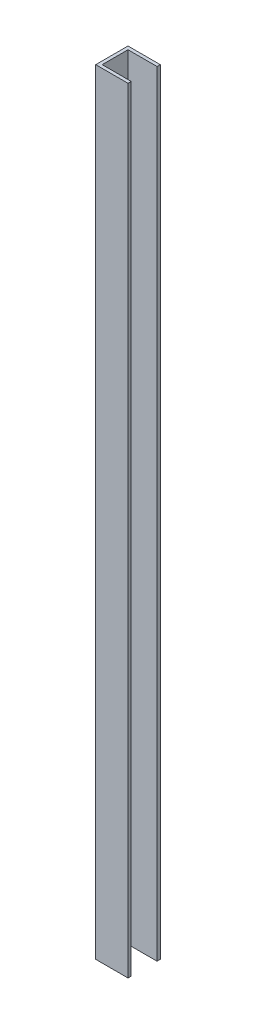
ISO-10303-21;
HEADER;
FILE_DESCRIPTION(('STEP AP214'),'2;1');
FILE_NAME('part.step','',(''),(''),'','','');
FILE_SCHEMA(('AUTOMOTIVE_DESIGN { 1 0 10303 214 1 1 1 1 }'));
ENDSEC;
DATA;
#1=APPLICATION_CONTEXT('core data for automotive mechanical design processes');
#2=APPLICATION_PROTOCOL_DEFINITION('international standard','automotive_design',2000,#1);
#3=PRODUCT_CONTEXT('',#1,'mechanical');
#4=PRODUCT('Part','Part','',(#3));
#5=PRODUCT_RELATED_PRODUCT_CATEGORY('part','',(#4));
#6=PRODUCT_DEFINITION_FORMATION('','',#4);
#7=PRODUCT_DEFINITION_CONTEXT('part definition',#1,'design');
#8=PRODUCT_DEFINITION('design','',#6,#7);
#9=PRODUCT_DEFINITION_SHAPE('','',#8);
#10=(LENGTH_UNIT() NAMED_UNIT(*) SI_UNIT(.MILLI.,.METRE.));
#11=(NAMED_UNIT(*) PLANE_ANGLE_UNIT() SI_UNIT($,.RADIAN.));
#12=(NAMED_UNIT(*) SI_UNIT($,.STERADIAN.) SOLID_ANGLE_UNIT());
#13=UNCERTAINTY_MEASURE_WITH_UNIT(LENGTH_MEASURE(1.E-05),#10,'distance_accuracy_value','');
#14=(GEOMETRIC_REPRESENTATION_CONTEXT(3) GLOBAL_UNCERTAINTY_ASSIGNED_CONTEXT((#13)) GLOBAL_UNIT_ASSIGNED_CONTEXT((#10,
#11,#12)) REPRESENTATION_CONTEXT('',''));
#15=CARTESIAN_POINT('',(0.,0.,0.));
#16=DIRECTION('',(0.,0.,1.));
#17=DIRECTION('',(1.,0.,0.));
#18=AXIS2_PLACEMENT_3D('',#15,#16,#17);
#19=CARTESIAN_POINT('',(-4.,240.,4.));
#20=DIRECTION('',(0.,0.,1.));
#21=DIRECTION('',(1.,0.,0.));
#22=AXIS2_PLACEMENT_3D('',#19,#20,#21);
#23=PLANE('',#22);
#24=DIRECTION('',(-1.,0.,0.));
#25=VECTOR('',#24,1.);
#26=CARTESIAN_POINT('',(-4.,0.,4.));
#27=LINE('',#26,#25);
#28=CARTESIAN_POINT('',(5.,0.,4.));
#29=VERTEX_POINT('',#28);
#30=CARTESIAN_POINT('',(-4.,0.,4.));
#31=VERTEX_POINT('',#30);
#32=EDGE_CURVE('E87',#29,#31,#27,.T.);
#33=ORIENTED_EDGE('',*,*,#32,.T.);
#34=DIRECTION('',(0.,-1.,0.));
#35=VECTOR('',#34,1.);
#36=CARTESIAN_POINT('',(-4.,240.,4.));
#37=LINE('',#36,#35);
#38=CARTESIAN_POINT('',(-4.,240.,4.));
#39=VERTEX_POINT('',#38);
#40=EDGE_CURVE('E11',#39,#31,#37,.T.);
#41=ORIENTED_EDGE('',*,*,#40,.F.);
#42=DIRECTION('',(-1.,0.,0.));
#43=VECTOR('',#42,1.);
#44=CARTESIAN_POINT('',(4.,240.,4.));
#45=LINE('',#44,#43);
#46=CARTESIAN_POINT('',(5.,240.,4.));
#47=VERTEX_POINT('',#46);
#48=EDGE_CURVE('E93',#47,#39,#45,.T.);
#49=ORIENTED_EDGE('',*,*,#48,.F.);
#50=DIRECTION('',(0.,-1.,0.));
#51=VECTOR('',#50,1.);
#52=CARTESIAN_POINT('',(5.,240.,4.));
#53=LINE('',#52,#51);
#54=EDGE_CURVE('E127',#47,#29,#53,.T.);
#55=ORIENTED_EDGE('',*,*,#54,.T.);
#56=EDGE_LOOP('',(#33,#41,#49,#55));
#57=FACE_BOUND('',#56,.T.);
#58=ADVANCED_FACE('F35',(#57),#23,.F.);
#59=CARTESIAN_POINT('',(-4.,240.,-4.));
#60=DIRECTION('',(-1.,0.,0.));
#61=DIRECTION('',(0.,0.,1.));
#62=AXIS2_PLACEMENT_3D('',#59,#60,#61);
#63=PLANE('',#62);
#64=DIRECTION('',(0.,0.,-1.));
#65=VECTOR('',#64,1.);
#66=CARTESIAN_POINT('',(-4.,0.,-4.));
#67=LINE('',#66,#65);
#68=CARTESIAN_POINT('',(-4.,0.,-4.));
#69=VERTEX_POINT('',#68);
#70=EDGE_CURVE('E132',#31,#69,#67,.T.);
#71=ORIENTED_EDGE('',*,*,#70,.T.);
#72=DIRECTION('',(0.,-1.,0.));
#73=VECTOR('',#72,1.);
#74=CARTESIAN_POINT('',(-4.,240.,-4.));
#75=LINE('',#74,#73);
#76=CARTESIAN_POINT('',(-4.,240.,-4.));
#77=VERTEX_POINT('',#76);
#78=EDGE_CURVE('E43',#77,#69,#75,.T.);
#79=ORIENTED_EDGE('',*,*,#78,.F.);
#80=DIRECTION('',(0.,0.,-1.));
#81=VECTOR('',#80,1.);
#82=CARTESIAN_POINT('',(-4.,240.,-4.));
#83=LINE('',#82,#81);
#84=EDGE_CURVE('E164',#39,#77,#83,.T.);
#85=ORIENTED_EDGE('',*,*,#84,.F.);
#86=ORIENTED_EDGE('',*,*,#40,.T.);
#87=EDGE_LOOP('',(#71,#79,#85,#86));
#88=FACE_BOUND('',#87,.T.);
#89=ADVANCED_FACE('F163',(#88),#63,.F.);
#90=CARTESIAN_POINT('',(4.,240.,-4.));
#91=DIRECTION('',(0.,0.,-1.));
#92=DIRECTION('',(-1.,0.,0.));
#93=AXIS2_PLACEMENT_3D('',#90,#91,#92);
#94=PLANE('',#93);
#95=DIRECTION('',(1.,0.,0.));
#96=VECTOR('',#95,1.);
#97=CARTESIAN_POINT('',(4.,0.,-4.));
#98=LINE('',#97,#96);
#99=CARTESIAN_POINT('',(5.,0.,-4.));
#100=VERTEX_POINT('',#99);
#101=EDGE_CURVE('E135',#69,#100,#98,.T.);
#102=ORIENTED_EDGE('',*,*,#101,.T.);
#103=DIRECTION('',(0.,-1.,0.));
#104=VECTOR('',#103,1.);
#105=CARTESIAN_POINT('',(5.,240.,-4.));
#106=LINE('',#105,#104);
#107=CARTESIAN_POINT('',(5.,240.,-4.));
#108=VERTEX_POINT('',#107);
#109=EDGE_CURVE('E152',#108,#100,#106,.T.);
#110=ORIENTED_EDGE('',*,*,#109,.F.);
#111=DIRECTION('',(1.,0.,0.));
#112=VECTOR('',#111,1.);
#113=CARTESIAN_POINT('',(-4.,240.,-4.));
#114=LINE('',#113,#112);
#115=EDGE_CURVE('E160',#77,#108,#114,.T.);
#116=ORIENTED_EDGE('',*,*,#115,.F.);
#117=ORIENTED_EDGE('',*,*,#78,.T.);
#118=EDGE_LOOP('',(#102,#110,#116,#117));
#119=FACE_BOUND('',#118,.T.);
#120=ADVANCED_FACE('F158',(#119),#94,.F.);
#121=CARTESIAN_POINT('',(5.,240.,-5.));
#122=DIRECTION('',(-1.,0.,0.));
#123=DIRECTION('',(0.,0.,1.));
#124=AXIS2_PLACEMENT_3D('',#121,#122,#123);
#125=PLANE('',#124);
#126=DIRECTION('',(0.,0.,-1.));
#127=VECTOR('',#126,1.);
#128=CARTESIAN_POINT('',(5.,0.,-5.));
#129=LINE('',#128,#127);
#130=CARTESIAN_POINT('',(5.,0.,-5.));
#131=VERTEX_POINT('',#130);
#132=EDGE_CURVE('E137',#100,#131,#129,.T.);
#133=ORIENTED_EDGE('',*,*,#132,.T.);
#134=DIRECTION('',(0.,-1.,0.));
#135=VECTOR('',#134,1.);
#136=CARTESIAN_POINT('',(5.,240.,-5.));
#137=LINE('',#136,#135);
#138=CARTESIAN_POINT('',(5.,240.,-5.));
#139=VERTEX_POINT('',#138);
#140=EDGE_CURVE('E149',#139,#131,#137,.T.);
#141=ORIENTED_EDGE('',*,*,#140,.F.);
#142=DIRECTION('',(0.,0.,-1.));
#143=VECTOR('',#142,1.);
#144=CARTESIAN_POINT('',(5.,240.,-5.));
#145=LINE('',#144,#143);
#146=EDGE_CURVE('E174',#108,#139,#145,.T.);
#147=ORIENTED_EDGE('',*,*,#146,.F.);
#148=ORIENTED_EDGE('',*,*,#109,.T.);
#149=EDGE_LOOP('',(#133,#141,#147,#148));
#150=FACE_BOUND('',#149,.T.);
#151=ADVANCED_FACE('F170',(#150),#125,.F.);
#152=CARTESIAN_POINT('',(-5.,240.,-5.));
#153=DIRECTION('',(0.,0.,1.));
#154=DIRECTION('',(1.,0.,0.));
#155=AXIS2_PLACEMENT_3D('',#152,#153,#154);
#156=PLANE('',#155);
#157=DIRECTION('',(-1.,0.,0.));
#158=VECTOR('',#157,1.);
#159=CARTESIAN_POINT('',(-5.,0.,-5.));
#160=LINE('',#159,#158);
#161=CARTESIAN_POINT('',(-5.,0.,-5.));
#162=VERTEX_POINT('',#161);
#163=EDGE_CURVE('E139',#131,#162,#160,.T.);
#164=ORIENTED_EDGE('',*,*,#163,.T.);
#165=DIRECTION('',(0.,-1.,0.));
#166=VECTOR('',#165,1.);
#167=CARTESIAN_POINT('',(-5.,240.,-5.));
#168=LINE('',#167,#166);
#169=CARTESIAN_POINT('',(-5.,240.,-5.));
#170=VERTEX_POINT('',#169);
#171=EDGE_CURVE('E122',#170,#162,#168,.T.);
#172=ORIENTED_EDGE('',*,*,#171,.F.);
#173=DIRECTION('',(-1.,0.,0.));
#174=VECTOR('',#173,1.);
#175=CARTESIAN_POINT('',(-5.,240.,-5.));
#176=LINE('',#175,#174);
#177=EDGE_CURVE('E113',#139,#170,#176,.T.);
#178=ORIENTED_EDGE('',*,*,#177,.F.);
#179=ORIENTED_EDGE('',*,*,#140,.T.);
#180=EDGE_LOOP('',(#164,#172,#178,#179));
#181=FACE_BOUND('',#180,.T.);
#182=ADVANCED_FACE('F173',(#181),#156,.F.);
#183=CARTESIAN_POINT('',(-5.,240.,-5.));
#184=DIRECTION('',(1.,0.,0.));
#185=DIRECTION('',(0.,0.,-1.));
#186=AXIS2_PLACEMENT_3D('',#183,#184,#185);
#187=PLANE('',#186);
#188=DIRECTION('',(0.,0.,1.));
#189=VECTOR('',#188,1.);
#190=CARTESIAN_POINT('',(-5.,0.,-5.));
#191=LINE('',#190,#189);
#192=CARTESIAN_POINT('',(-5.,0.,5.));
#193=VERTEX_POINT('',#192);
#194=EDGE_CURVE('E121',#162,#193,#191,.T.);
#195=ORIENTED_EDGE('',*,*,#194,.T.);
#196=DIRECTION('',(0.,-1.,0.));
#197=VECTOR('',#196,1.);
#198=CARTESIAN_POINT('',(-5.,240.,5.));
#199=LINE('',#198,#197);
#200=CARTESIAN_POINT('',(-5.,240.,5.));
#201=VERTEX_POINT('',#200);
#202=EDGE_CURVE('E118',#201,#193,#199,.T.);
#203=ORIENTED_EDGE('',*,*,#202,.F.);
#204=DIRECTION('',(0.,0.,1.));
#205=VECTOR('',#204,1.);
#206=CARTESIAN_POINT('',(-5.,240.,-5.));
#207=LINE('',#206,#205);
#208=EDGE_CURVE('E107',#170,#201,#207,.T.);
#209=ORIENTED_EDGE('',*,*,#208,.F.);
#210=ORIENTED_EDGE('',*,*,#171,.T.);
#211=EDGE_LOOP('',(#195,#203,#209,#210));
#212=FACE_BOUND('',#211,.T.);
#213=ADVANCED_FACE('F119',(#212),#187,.F.);
#214=CARTESIAN_POINT('',(-5.,240.,5.));
#215=DIRECTION('',(0.,0.,-1.));
#216=DIRECTION('',(-1.,0.,0.));
#217=AXIS2_PLACEMENT_3D('',#214,#215,#216);
#218=PLANE('',#217);
#219=DIRECTION('',(1.,0.,0.));
#220=VECTOR('',#219,1.);
#221=CARTESIAN_POINT('',(-5.,0.,5.));
#222=LINE('',#221,#220);
#223=CARTESIAN_POINT('',(5.,0.,5.));
#224=VERTEX_POINT('',#223);
#225=EDGE_CURVE('E80',#193,#224,#222,.T.);
#226=ORIENTED_EDGE('',*,*,#225,.T.);
#227=DIRECTION('',(0.,-1.,0.));
#228=VECTOR('',#227,1.);
#229=CARTESIAN_POINT('',(5.,240.,5.));
#230=LINE('',#229,#228);
#231=CARTESIAN_POINT('',(5.,240.,5.));
#232=VERTEX_POINT('',#231);
#233=EDGE_CURVE('E123',#232,#224,#230,.T.);
#234=ORIENTED_EDGE('',*,*,#233,.F.);
#235=DIRECTION('',(1.,0.,0.));
#236=VECTOR('',#235,1.);
#237=CARTESIAN_POINT('',(-5.,240.,5.));
#238=LINE('',#237,#236);
#239=EDGE_CURVE('E111',#201,#232,#238,.T.);
#240=ORIENTED_EDGE('',*,*,#239,.F.);
#241=ORIENTED_EDGE('',*,*,#202,.T.);
#242=EDGE_LOOP('',(#226,#234,#240,#241));
#243=FACE_BOUND('',#242,.T.);
#244=ADVANCED_FACE('F125',(#243),#218,.F.);
#245=CARTESIAN_POINT('',(5.,240.,4.));
#246=DIRECTION('',(-1.,0.,0.));
#247=DIRECTION('',(0.,0.,1.));
#248=AXIS2_PLACEMENT_3D('',#245,#246,#247);
#249=PLANE('',#248);
#250=DIRECTION('',(0.,0.,-1.));
#251=VECTOR('',#250,1.);
#252=CARTESIAN_POINT('',(5.,0.,4.));
#253=LINE('',#252,#251);
#254=EDGE_CURVE('E143',#224,#29,#253,.T.);
#255=ORIENTED_EDGE('',*,*,#254,.T.);
#256=ORIENTED_EDGE('',*,*,#54,.F.);
#257=DIRECTION('',(0.,0.,-1.));
#258=VECTOR('',#257,1.);
#259=CARTESIAN_POINT('',(5.,240.,4.));
#260=LINE('',#259,#258);
#261=EDGE_CURVE('E51',#232,#47,#260,.T.);
#262=ORIENTED_EDGE('',*,*,#261,.F.);
#263=ORIENTED_EDGE('',*,*,#233,.T.);
#264=EDGE_LOOP('',(#255,#256,#262,#263));
#265=FACE_BOUND('',#264,.T.);
#266=ADVANCED_FACE('F180',(#265),#249,.F.);
#267=CARTESIAN_POINT('',(0.,240.,0.));
#268=DIRECTION('',(0.,-1.,0.));
#269=DIRECTION('',(0.,0.,-1.));
#270=AXIS2_PLACEMENT_3D('',#267,#268,#269);
#271=PLANE('',#270);
#272=ORIENTED_EDGE('',*,*,#48,.T.);
#273=ORIENTED_EDGE('',*,*,#84,.T.);
#274=ORIENTED_EDGE('',*,*,#115,.T.);
#275=ORIENTED_EDGE('',*,*,#146,.T.);
#276=ORIENTED_EDGE('',*,*,#177,.T.);
#277=ORIENTED_EDGE('',*,*,#208,.T.);
#278=ORIENTED_EDGE('',*,*,#239,.T.);
#279=ORIENTED_EDGE('',*,*,#261,.T.);
#280=EDGE_LOOP('',(#272,#273,#274,#275,#276,#277,#278,#279));
#281=FACE_BOUND('',#280,.T.);
#282=ADVANCED_FACE('F109',(#281),#271,.F.);
#283=CARTESIAN_POINT('',(0.,0.,0.));
#284=DIRECTION('',(0.,-1.,0.));
#285=DIRECTION('',(0.,0.,-1.));
#286=AXIS2_PLACEMENT_3D('',#283,#284,#285);
#287=PLANE('',#286);
#288=ORIENTED_EDGE('',*,*,#32,.F.);
#289=ORIENTED_EDGE('',*,*,#254,.F.);
#290=ORIENTED_EDGE('',*,*,#225,.F.);
#291=ORIENTED_EDGE('',*,*,#194,.F.);
#292=ORIENTED_EDGE('',*,*,#163,.F.);
#293=ORIENTED_EDGE('',*,*,#132,.F.);
#294=ORIENTED_EDGE('',*,*,#101,.F.);
#295=ORIENTED_EDGE('',*,*,#70,.F.);
#296=EDGE_LOOP('',(#288,#289,#290,#291,#292,#293,#294,#295));
#297=FACE_BOUND('',#296,.T.);
#298=ADVANCED_FACE('F165',(#297),#287,.T.);
#299=CLOSED_SHELL('',(#58,#89,#120,#151,#182,#213,#244,#266,#282,#298));
#300=MANIFOLD_SOLID_BREP('B2',#299);
#301=ADVANCED_BREP_SHAPE_REPRESENTATION('',(#18,#300),#14);
#302=SHAPE_DEFINITION_REPRESENTATION(#9,#301);
ENDSEC;
END-ISO-10303-21;
